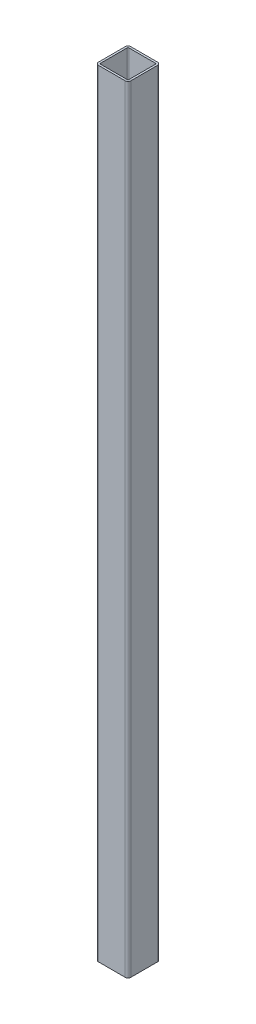
ISO-10303-21;
HEADER;
FILE_DESCRIPTION(('STEP AP214'),'2;1');
FILE_NAME('part.step','',(''),(''),'','','');
FILE_SCHEMA(('AUTOMOTIVE_DESIGN { 1 0 10303 214 1 1 1 1 }'));
ENDSEC;
DATA;
#1=APPLICATION_CONTEXT('core data for automotive mechanical design processes');
#2=APPLICATION_PROTOCOL_DEFINITION('international standard','automotive_design',2000,#1);
#3=PRODUCT_CONTEXT('',#1,'mechanical');
#4=PRODUCT('Part','Part','',(#3));
#5=PRODUCT_RELATED_PRODUCT_CATEGORY('part','',(#4));
#6=PRODUCT_DEFINITION_FORMATION('','',#4);
#7=PRODUCT_DEFINITION_CONTEXT('part definition',#1,'design');
#8=PRODUCT_DEFINITION('design','',#6,#7);
#9=PRODUCT_DEFINITION_SHAPE('','',#8);
#10=(LENGTH_UNIT() NAMED_UNIT(*) SI_UNIT(.MILLI.,.METRE.));
#11=(NAMED_UNIT(*) PLANE_ANGLE_UNIT() SI_UNIT($,.RADIAN.));
#12=(NAMED_UNIT(*) SI_UNIT($,.STERADIAN.) SOLID_ANGLE_UNIT());
#13=UNCERTAINTY_MEASURE_WITH_UNIT(LENGTH_MEASURE(1.E-05),#10,'distance_accuracy_value','');
#14=(GEOMETRIC_REPRESENTATION_CONTEXT(3) GLOBAL_UNCERTAINTY_ASSIGNED_CONTEXT((#13)) GLOBAL_UNIT_ASSIGNED_CONTEXT((#10,
#11,#12)) REPRESENTATION_CONTEXT('',''));
#15=CARTESIAN_POINT('',(0.,0.,0.));
#16=DIRECTION('',(0.,0.,1.));
#17=DIRECTION('',(1.,0.,0.));
#18=AXIS2_PLACEMENT_3D('',#15,#16,#17);
#19=CARTESIAN_POINT('',(20.955,1219.2,-20.955));
#20=DIRECTION('',(0.,-1.,0.));
#21=DIRECTION('',(0.,0.,-1.));
#22=AXIS2_PLACEMENT_3D('',#19,#20,#21);
#23=PLANE('',#22);
#24=CARTESIAN_POINT('',(20.955,1219.2,-20.955));
#25=DIRECTION('',(0.,1.,0.));
#26=DIRECTION('',(0.,0.,-1.));
#27=AXIS2_PLACEMENT_3D('',#24,#25,#26);
#28=CIRCLE('',#27,4.445);
#29=CARTESIAN_POINT('',(25.4,1219.2,-20.955));
#30=VERTEX_POINT('',#29);
#31=CARTESIAN_POINT('',(20.955,1219.2,-25.4));
#32=VERTEX_POINT('',#31);
#33=EDGE_CURVE('E211',#30,#32,#28,.T.);
#34=ORIENTED_EDGE('',*,*,#33,.T.);
#35=DIRECTION('',(-1.,0.,0.));
#36=VECTOR('',#35,1.);
#37=CARTESIAN_POINT('',(-20.955,1219.2,-25.4));
#38=LINE('',#37,#36);
#39=CARTESIAN_POINT('',(-20.955,1219.2,-25.4));
#40=VERTEX_POINT('',#39);
#41=EDGE_CURVE('E214',#32,#40,#38,.T.);
#42=ORIENTED_EDGE('',*,*,#41,.T.);
#43=CARTESIAN_POINT('',(-20.955,1219.2,-20.955));
#44=DIRECTION('',(0.,1.,0.));
#45=DIRECTION('',(0.,0.,-1.));
#46=AXIS2_PLACEMENT_3D('',#43,#44,#45);
#47=CIRCLE('',#46,4.445);
#48=CARTESIAN_POINT('',(-25.4,1219.2,-20.955));
#49=VERTEX_POINT('',#48);
#50=EDGE_CURVE('E217',#40,#49,#47,.T.);
#51=ORIENTED_EDGE('',*,*,#50,.T.);
#52=DIRECTION('',(0.,0.,1.));
#53=VECTOR('',#52,1.);
#54=CARTESIAN_POINT('',(-25.4,1219.2,20.955));
#55=LINE('',#54,#53);
#56=CARTESIAN_POINT('',(-25.4,1219.2,20.955));
#57=VERTEX_POINT('',#56);
#58=EDGE_CURVE('E219',#49,#57,#55,.T.);
#59=ORIENTED_EDGE('',*,*,#58,.T.);
#60=CARTESIAN_POINT('',(-20.955,1219.2,20.955));
#61=DIRECTION('',(0.,1.,0.));
#62=DIRECTION('',(0.,0.,-1.));
#63=AXIS2_PLACEMENT_3D('',#60,#61,#62);
#64=CIRCLE('',#63,4.445);
#65=CARTESIAN_POINT('',(-20.955,1219.2,25.4));
#66=VERTEX_POINT('',#65);
#67=EDGE_CURVE('E221',#57,#66,#64,.T.);
#68=ORIENTED_EDGE('',*,*,#67,.T.);
#69=DIRECTION('',(1.,0.,0.));
#70=VECTOR('',#69,1.);
#71=CARTESIAN_POINT('',(-20.955,1219.2,25.4));
#72=LINE('',#71,#70);
#73=CARTESIAN_POINT('',(20.955,1219.2,25.4));
#74=VERTEX_POINT('',#73);
#75=EDGE_CURVE('E223',#66,#74,#72,.T.);
#76=ORIENTED_EDGE('',*,*,#75,.T.);
#77=CARTESIAN_POINT('',(20.955,1219.2,20.955));
#78=DIRECTION('',(0.,1.,0.));
#79=DIRECTION('',(0.,0.,1.));
#80=AXIS2_PLACEMENT_3D('',#77,#78,#79);
#81=CIRCLE('',#80,4.445);
#82=CARTESIAN_POINT('',(25.4,1219.2,20.955));
#83=VERTEX_POINT('',#82);
#84=EDGE_CURVE('E225',#74,#83,#81,.T.);
#85=ORIENTED_EDGE('',*,*,#84,.T.);
#86=DIRECTION('',(0.,0.,-1.));
#87=VECTOR('',#86,1.);
#88=CARTESIAN_POINT('',(25.4,1219.2,20.955));
#89=LINE('',#88,#87);
#90=EDGE_CURVE('E227',#83,#30,#89,.T.);
#91=ORIENTED_EDGE('',*,*,#90,.T.);
#92=EDGE_LOOP('',(#34,#42,#51,#59,#68,#76,#85,#91));
#93=FACE_BOUND('',#92,.T.);
#94=CARTESIAN_POINT('',(-20.955,1219.2,20.955));
#95=DIRECTION('',(0.,1.,0.));
#96=DIRECTION('',(0.,0.,-1.));
#97=AXIS2_PLACEMENT_3D('',#94,#95,#96);
#98=CIRCLE('',#97,1.27);
#99=CARTESIAN_POINT('',(-22.225,1219.2,20.955));
#100=VERTEX_POINT('',#99);
#101=CARTESIAN_POINT('',(-20.955,1219.2,22.225));
#102=VERTEX_POINT('',#101);
#103=EDGE_CURVE('E146',#100,#102,#98,.T.);
#104=ORIENTED_EDGE('',*,*,#103,.F.);
#105=DIRECTION('',(0.,0.,1.));
#106=VECTOR('',#105,1.);
#107=CARTESIAN_POINT('',(-22.225,1219.2,20.955));
#108=LINE('',#107,#106);
#109=CARTESIAN_POINT('',(-22.225,1219.2,-20.955));
#110=VERTEX_POINT('',#109);
#111=EDGE_CURVE('E179',#110,#100,#108,.T.);
#112=ORIENTED_EDGE('',*,*,#111,.F.);
#113=CARTESIAN_POINT('',(-20.955,1219.2,-20.955));
#114=DIRECTION('',(0.,1.,0.));
#115=DIRECTION('',(0.,0.,-1.));
#116=AXIS2_PLACEMENT_3D('',#113,#114,#115);
#117=CIRCLE('',#116,1.27);
#118=CARTESIAN_POINT('',(-20.955,1219.2,-22.225));
#119=VERTEX_POINT('',#118);
#120=EDGE_CURVE('E177',#119,#110,#117,.T.);
#121=ORIENTED_EDGE('',*,*,#120,.F.);
#122=DIRECTION('',(-1.,0.,0.));
#123=VECTOR('',#122,1.);
#124=CARTESIAN_POINT('',(-20.955,1219.2,-22.225));
#125=LINE('',#124,#123);
#126=CARTESIAN_POINT('',(20.955,1219.2,-22.225));
#127=VERTEX_POINT('',#126);
#128=EDGE_CURVE('E175',#127,#119,#125,.T.);
#129=ORIENTED_EDGE('',*,*,#128,.F.);
#130=CARTESIAN_POINT('',(20.955,1219.2,-20.955));
#131=DIRECTION('',(0.,1.,0.));
#132=DIRECTION('',(0.,0.,-1.));
#133=AXIS2_PLACEMENT_3D('',#130,#131,#132);
#134=CIRCLE('',#133,1.27);
#135=CARTESIAN_POINT('',(22.225,1219.2,-20.955));
#136=VERTEX_POINT('',#135);
#137=EDGE_CURVE('E173',#136,#127,#134,.T.);
#138=ORIENTED_EDGE('',*,*,#137,.F.);
#139=DIRECTION('',(0.,0.,-1.));
#140=VECTOR('',#139,1.);
#141=CARTESIAN_POINT('',(22.225,1219.2,20.955));
#142=LINE('',#141,#140);
#143=CARTESIAN_POINT('',(22.225,1219.2,20.955));
#144=VERTEX_POINT('',#143);
#145=EDGE_CURVE('E169',#144,#136,#142,.T.);
#146=ORIENTED_EDGE('',*,*,#145,.F.);
#147=CARTESIAN_POINT('',(20.955,1219.2,20.955));
#148=DIRECTION('',(0.,1.,0.));
#149=DIRECTION('',(0.,0.,1.));
#150=AXIS2_PLACEMENT_3D('',#147,#148,#149);
#151=CIRCLE('',#150,1.27);
#152=CARTESIAN_POINT('',(20.955,1219.2,22.225));
#153=VERTEX_POINT('',#152);
#154=EDGE_CURVE('E167',#153,#144,#151,.T.);
#155=ORIENTED_EDGE('',*,*,#154,.F.);
#156=DIRECTION('',(1.,0.,0.));
#157=VECTOR('',#156,1.);
#158=CARTESIAN_POINT('',(-20.955,1219.2,22.225));
#159=LINE('',#158,#157);
#160=EDGE_CURVE('E154',#102,#153,#159,.T.);
#161=ORIENTED_EDGE('',*,*,#160,.F.);
#162=EDGE_LOOP('',(#104,#112,#121,#129,#138,#146,#155,#161));
#163=FACE_BOUND('',#162,.T.);
#164=ADVANCED_FACE('F33',(#93,#163),#23,.F.);
#165=CARTESIAN_POINT('',(20.955,0.,-20.955));
#166=DIRECTION('',(0.,-1.,0.));
#167=DIRECTION('',(0.,0.,-1.));
#168=AXIS2_PLACEMENT_3D('',#165,#166,#167);
#169=PLANE('',#168);
#170=CARTESIAN_POINT('',(20.955,0.,-20.955));
#171=DIRECTION('',(0.,1.,0.));
#172=DIRECTION('',(0.,0.,-1.));
#173=AXIS2_PLACEMENT_3D('',#170,#171,#172);
#174=CIRCLE('',#173,4.445);
#175=CARTESIAN_POINT('',(25.4,0.,-20.955));
#176=VERTEX_POINT('',#175);
#177=CARTESIAN_POINT('',(20.955,0.,-25.4));
#178=VERTEX_POINT('',#177);
#179=EDGE_CURVE('E162',#176,#178,#174,.T.);
#180=ORIENTED_EDGE('',*,*,#179,.F.);
#181=DIRECTION('',(0.,0.,-1.));
#182=VECTOR('',#181,1.);
#183=CARTESIAN_POINT('',(25.4,0.,20.955));
#184=LINE('',#183,#182);
#185=CARTESIAN_POINT('',(25.4,0.,20.955));
#186=VERTEX_POINT('',#185);
#187=EDGE_CURVE('E215',#186,#176,#184,.T.);
#188=ORIENTED_EDGE('',*,*,#187,.F.);
#189=CARTESIAN_POINT('',(20.955,0.,20.955));
#190=DIRECTION('',(0.,1.,0.));
#191=DIRECTION('',(0.,0.,1.));
#192=AXIS2_PLACEMENT_3D('',#189,#190,#191);
#193=CIRCLE('',#192,4.445);
#194=CARTESIAN_POINT('',(20.955,0.,25.4));
#195=VERTEX_POINT('',#194);
#196=EDGE_CURVE('E242',#195,#186,#193,.T.);
#197=ORIENTED_EDGE('',*,*,#196,.F.);
#198=DIRECTION('',(1.,0.,0.));
#199=VECTOR('',#198,1.);
#200=CARTESIAN_POINT('',(-20.955,0.,25.4));
#201=LINE('',#200,#199);
#202=CARTESIAN_POINT('',(-20.955,0.,25.4));
#203=VERTEX_POINT('',#202);
#204=EDGE_CURVE('E240',#203,#195,#201,.T.);
#205=ORIENTED_EDGE('',*,*,#204,.F.);
#206=CARTESIAN_POINT('',(-20.955,0.,20.955));
#207=DIRECTION('',(0.,1.,0.));
#208=DIRECTION('',(0.,0.,-1.));
#209=AXIS2_PLACEMENT_3D('',#206,#207,#208);
#210=CIRCLE('',#209,4.445);
#211=CARTESIAN_POINT('',(-25.4,0.,20.955));
#212=VERTEX_POINT('',#211);
#213=EDGE_CURVE('E238',#212,#203,#210,.T.);
#214=ORIENTED_EDGE('',*,*,#213,.F.);
#215=DIRECTION('',(0.,0.,1.));
#216=VECTOR('',#215,1.);
#217=CARTESIAN_POINT('',(-25.4,0.,20.955));
#218=LINE('',#217,#216);
#219=CARTESIAN_POINT('',(-25.4,0.,-20.955));
#220=VERTEX_POINT('',#219);
#221=EDGE_CURVE('E236',#220,#212,#218,.T.);
#222=ORIENTED_EDGE('',*,*,#221,.F.);
#223=CARTESIAN_POINT('',(-20.955,0.,-20.955));
#224=DIRECTION('',(0.,1.,0.));
#225=DIRECTION('',(0.,0.,-1.));
#226=AXIS2_PLACEMENT_3D('',#223,#224,#225);
#227=CIRCLE('',#226,4.445);
#228=CARTESIAN_POINT('',(-20.955,0.,-25.4));
#229=VERTEX_POINT('',#228);
#230=EDGE_CURVE('E234',#229,#220,#227,.T.);
#231=ORIENTED_EDGE('',*,*,#230,.F.);
#232=DIRECTION('',(-1.,0.,0.));
#233=VECTOR('',#232,1.);
#234=CARTESIAN_POINT('',(-20.955,0.,-25.4));
#235=LINE('',#234,#233);
#236=EDGE_CURVE('E232',#178,#229,#235,.T.);
#237=ORIENTED_EDGE('',*,*,#236,.F.);
#238=EDGE_LOOP('',(#180,#188,#197,#205,#214,#222,#231,#237));
#239=FACE_BOUND('',#238,.T.);
#240=DIRECTION('',(0.,0.,1.));
#241=VECTOR('',#240,1.);
#242=CARTESIAN_POINT('',(-22.225,0.,20.955));
#243=LINE('',#242,#241);
#244=CARTESIAN_POINT('',(-22.225,0.,-20.955));
#245=VERTEX_POINT('',#244);
#246=CARTESIAN_POINT('',(-22.225,0.,20.955));
#247=VERTEX_POINT('',#246);
#248=EDGE_CURVE('E155',#245,#247,#243,.T.);
#249=ORIENTED_EDGE('',*,*,#248,.T.);
#250=CARTESIAN_POINT('',(-20.955,0.,20.955));
#251=DIRECTION('',(0.,1.,0.));
#252=DIRECTION('',(0.,0.,-1.));
#253=AXIS2_PLACEMENT_3D('',#250,#251,#252);
#254=CIRCLE('',#253,1.27);
#255=CARTESIAN_POINT('',(-20.955,0.,22.225));
#256=VERTEX_POINT('',#255);
#257=EDGE_CURVE('E56',#247,#256,#254,.T.);
#258=ORIENTED_EDGE('',*,*,#257,.T.);
#259=DIRECTION('',(1.,0.,0.));
#260=VECTOR('',#259,1.);
#261=CARTESIAN_POINT('',(-20.955,0.,22.225));
#262=LINE('',#261,#260);
#263=CARTESIAN_POINT('',(20.955,0.,22.225));
#264=VERTEX_POINT('',#263);
#265=EDGE_CURVE('E161',#256,#264,#262,.T.);
#266=ORIENTED_EDGE('',*,*,#265,.T.);
#267=CARTESIAN_POINT('',(20.955,0.,20.955));
#268=DIRECTION('',(0.,1.,0.));
#269=DIRECTION('',(0.,0.,1.));
#270=AXIS2_PLACEMENT_3D('',#267,#268,#269);
#271=CIRCLE('',#270,1.27);
#272=CARTESIAN_POINT('',(22.225,0.,20.955));
#273=VERTEX_POINT('',#272);
#274=EDGE_CURVE('E183',#264,#273,#271,.T.);
#275=ORIENTED_EDGE('',*,*,#274,.T.);
#276=DIRECTION('',(0.,0.,-1.));
#277=VECTOR('',#276,1.);
#278=CARTESIAN_POINT('',(22.225,0.,20.955));
#279=LINE('',#278,#277);
#280=CARTESIAN_POINT('',(22.225,0.,-20.955));
#281=VERTEX_POINT('',#280);
#282=EDGE_CURVE('E186',#273,#281,#279,.T.);
#283=ORIENTED_EDGE('',*,*,#282,.T.);
#284=CARTESIAN_POINT('',(20.955,0.,-20.955));
#285=DIRECTION('',(0.,1.,0.));
#286=DIRECTION('',(0.,0.,-1.));
#287=AXIS2_PLACEMENT_3D('',#284,#285,#286);
#288=CIRCLE('',#287,1.27);
#289=CARTESIAN_POINT('',(20.955,0.,-22.225));
#290=VERTEX_POINT('',#289);
#291=EDGE_CURVE('E189',#281,#290,#288,.T.);
#292=ORIENTED_EDGE('',*,*,#291,.T.);
#293=DIRECTION('',(-1.,0.,0.));
#294=VECTOR('',#293,1.);
#295=CARTESIAN_POINT('',(-20.955,0.,-22.225));
#296=LINE('',#295,#294);
#297=CARTESIAN_POINT('',(-20.955,0.,-22.225));
#298=VERTEX_POINT('',#297);
#299=EDGE_CURVE('E192',#290,#298,#296,.T.);
#300=ORIENTED_EDGE('',*,*,#299,.T.);
#301=CARTESIAN_POINT('',(-20.955,0.,-20.955));
#302=DIRECTION('',(0.,1.,0.));
#303=DIRECTION('',(0.,0.,-1.));
#304=AXIS2_PLACEMENT_3D('',#301,#302,#303);
#305=CIRCLE('',#304,1.27);
#306=EDGE_CURVE('E195',#298,#245,#305,.T.);
#307=ORIENTED_EDGE('',*,*,#306,.T.);
#308=EDGE_LOOP('',(#249,#258,#266,#275,#283,#292,#300,#307));
#309=FACE_BOUND('',#308,.T.);
#310=ADVANCED_FACE('F272',(#239,#309),#169,.T.);
#311=CARTESIAN_POINT('',(20.955,1219.2,-20.955));
#312=DIRECTION('',(0.,-1.,0.));
#313=DIRECTION('',(0.,0.,-1.));
#314=AXIS2_PLACEMENT_3D('',#311,#312,#313);
#315=CYLINDRICAL_SURFACE('',#314,4.445);
#316=ORIENTED_EDGE('',*,*,#179,.T.);
#317=DIRECTION('',(0.,-1.,0.));
#318=VECTOR('',#317,1.);
#319=CARTESIAN_POINT('',(20.955,1219.2,-25.4));
#320=LINE('',#319,#318);
#321=EDGE_CURVE('E11',#32,#178,#320,.T.);
#322=ORIENTED_EDGE('',*,*,#321,.F.);
#323=ORIENTED_EDGE('',*,*,#33,.F.);
#324=DIRECTION('',(0.,-1.,0.));
#325=VECTOR('',#324,1.);
#326=CARTESIAN_POINT('',(25.4,1219.2,-20.955));
#327=LINE('',#326,#325);
#328=EDGE_CURVE('E229',#30,#176,#327,.T.);
#329=ORIENTED_EDGE('',*,*,#328,.T.);
#330=EDGE_LOOP('',(#316,#322,#323,#329));
#331=FACE_BOUND('',#330,.T.);
#332=ADVANCED_FACE('F35',(#331),#315,.T.);
#333=CARTESIAN_POINT('',(-20.955,1219.2,-25.4));
#334=DIRECTION('',(0.,0.,1.));
#335=DIRECTION('',(1.,0.,0.));
#336=AXIS2_PLACEMENT_3D('',#333,#334,#335);
#337=PLANE('',#336);
#338=ORIENTED_EDGE('',*,*,#236,.T.);
#339=DIRECTION('',(0.,-1.,0.));
#340=VECTOR('',#339,1.);
#341=CARTESIAN_POINT('',(-20.955,1219.2,-25.4));
#342=LINE('',#341,#340);
#343=EDGE_CURVE('E41',#40,#229,#342,.T.);
#344=ORIENTED_EDGE('',*,*,#343,.F.);
#345=ORIENTED_EDGE('',*,*,#41,.F.);
#346=ORIENTED_EDGE('',*,*,#321,.T.);
#347=EDGE_LOOP('',(#338,#344,#345,#346));
#348=FACE_BOUND('',#347,.T.);
#349=ADVANCED_FACE('F289',(#348),#337,.F.);
#350=CARTESIAN_POINT('',(-20.955,1219.2,-20.955));
#351=DIRECTION('',(0.,-1.,0.));
#352=DIRECTION('',(0.,0.,-1.));
#353=AXIS2_PLACEMENT_3D('',#350,#351,#352);
#354=CYLINDRICAL_SURFACE('',#353,4.445);
#355=ORIENTED_EDGE('',*,*,#230,.T.);
#356=DIRECTION('',(0.,-1.,0.));
#357=VECTOR('',#356,1.);
#358=CARTESIAN_POINT('',(-25.4,1219.2,-20.955));
#359=LINE('',#358,#357);
#360=EDGE_CURVE('E259',#49,#220,#359,.T.);
#361=ORIENTED_EDGE('',*,*,#360,.F.);
#362=ORIENTED_EDGE('',*,*,#50,.F.);
#363=ORIENTED_EDGE('',*,*,#343,.T.);
#364=EDGE_LOOP('',(#355,#361,#362,#363));
#365=FACE_BOUND('',#364,.T.);
#366=ADVANCED_FACE('F266',(#365),#354,.T.);
#367=CARTESIAN_POINT('',(-25.4,1219.2,20.955));
#368=DIRECTION('',(1.,0.,0.));
#369=DIRECTION('',(0.,0.,-1.));
#370=AXIS2_PLACEMENT_3D('',#367,#368,#369);
#371=PLANE('',#370);
#372=ORIENTED_EDGE('',*,*,#221,.T.);
#373=DIRECTION('',(0.,-1.,0.));
#374=VECTOR('',#373,1.);
#375=CARTESIAN_POINT('',(-25.4,1219.2,20.955));
#376=LINE('',#375,#374);
#377=EDGE_CURVE('E256',#57,#212,#376,.T.);
#378=ORIENTED_EDGE('',*,*,#377,.F.);
#379=ORIENTED_EDGE('',*,*,#58,.F.);
#380=ORIENTED_EDGE('',*,*,#360,.T.);
#381=EDGE_LOOP('',(#372,#378,#379,#380));
#382=FACE_BOUND('',#381,.T.);
#383=ADVANCED_FACE('F278',(#382),#371,.F.);
#384=CARTESIAN_POINT('',(-20.955,1219.2,20.955));
#385=DIRECTION('',(0.,-1.,0.));
#386=DIRECTION('',(0.,0.,-1.));
#387=AXIS2_PLACEMENT_3D('',#384,#385,#386);
#388=CYLINDRICAL_SURFACE('',#387,4.445);
#389=ORIENTED_EDGE('',*,*,#213,.T.);
#390=DIRECTION('',(0.,-1.,0.));
#391=VECTOR('',#390,1.);
#392=CARTESIAN_POINT('',(-20.955,1219.2,25.4));
#393=LINE('',#392,#391);
#394=EDGE_CURVE('E253',#66,#203,#393,.T.);
#395=ORIENTED_EDGE('',*,*,#394,.F.);
#396=ORIENTED_EDGE('',*,*,#67,.F.);
#397=ORIENTED_EDGE('',*,*,#377,.T.);
#398=EDGE_LOOP('',(#389,#395,#396,#397));
#399=FACE_BOUND('',#398,.T.);
#400=ADVANCED_FACE('F282',(#399),#388,.T.);
#401=CARTESIAN_POINT('',(-20.955,1219.2,25.4));
#402=DIRECTION('',(0.,0.,-1.));
#403=DIRECTION('',(-1.,0.,0.));
#404=AXIS2_PLACEMENT_3D('',#401,#402,#403);
#405=PLANE('',#404);
#406=ORIENTED_EDGE('',*,*,#204,.T.);
#407=DIRECTION('',(0.,-1.,0.));
#408=VECTOR('',#407,1.);
#409=CARTESIAN_POINT('',(20.955,1219.2,25.4));
#410=LINE('',#409,#408);
#411=EDGE_CURVE('E250',#74,#195,#410,.T.);
#412=ORIENTED_EDGE('',*,*,#411,.F.);
#413=ORIENTED_EDGE('',*,*,#75,.F.);
#414=ORIENTED_EDGE('',*,*,#394,.T.);
#415=EDGE_LOOP('',(#406,#412,#413,#414));
#416=FACE_BOUND('',#415,.T.);
#417=ADVANCED_FACE('F302',(#416),#405,.F.);
#418=CARTESIAN_POINT('',(20.955,1219.2,20.955));
#419=DIRECTION('',(0.,-1.,0.));
#420=DIRECTION('',(0.,0.,-1.));
#421=AXIS2_PLACEMENT_3D('',#418,#419,#420);
#422=CYLINDRICAL_SURFACE('',#421,4.445);
#423=ORIENTED_EDGE('',*,*,#196,.T.);
#424=DIRECTION('',(0.,-1.,0.));
#425=VECTOR('',#424,1.);
#426=CARTESIAN_POINT('',(25.4,1219.2,20.955));
#427=LINE('',#426,#425);
#428=EDGE_CURVE('E247',#83,#186,#427,.T.);
#429=ORIENTED_EDGE('',*,*,#428,.F.);
#430=ORIENTED_EDGE('',*,*,#84,.F.);
#431=ORIENTED_EDGE('',*,*,#411,.T.);
#432=EDGE_LOOP('',(#423,#429,#430,#431));
#433=FACE_BOUND('',#432,.T.);
#434=ADVANCED_FACE('F300',(#433),#422,.T.);
#435=CARTESIAN_POINT('',(25.4,1219.2,20.955));
#436=DIRECTION('',(-1.,0.,0.));
#437=DIRECTION('',(0.,0.,1.));
#438=AXIS2_PLACEMENT_3D('',#435,#436,#437);
#439=PLANE('',#438);
#440=ORIENTED_EDGE('',*,*,#187,.T.);
#441=ORIENTED_EDGE('',*,*,#328,.F.);
#442=ORIENTED_EDGE('',*,*,#90,.F.);
#443=ORIENTED_EDGE('',*,*,#428,.T.);
#444=EDGE_LOOP('',(#440,#441,#442,#443));
#445=FACE_BOUND('',#444,.T.);
#446=ADVANCED_FACE('F295',(#445),#439,.F.);
#447=CARTESIAN_POINT('',(-20.955,1219.2,20.955));
#448=DIRECTION('',(0.,-1.,0.));
#449=DIRECTION('',(0.,0.,-1.));
#450=AXIS2_PLACEMENT_3D('',#447,#448,#449);
#451=CYLINDRICAL_SURFACE('',#450,1.27);
#452=ORIENTED_EDGE('',*,*,#257,.F.);
#453=DIRECTION('',(0.,-1.,0.));
#454=VECTOR('',#453,1.);
#455=CARTESIAN_POINT('',(-22.225,1219.2,20.955));
#456=LINE('',#455,#454);
#457=EDGE_CURVE('E150',#100,#247,#456,.T.);
#458=ORIENTED_EDGE('',*,*,#457,.F.);
#459=ORIENTED_EDGE('',*,*,#103,.T.);
#460=DIRECTION('',(0.,-1.,0.));
#461=VECTOR('',#460,1.);
#462=CARTESIAN_POINT('',(-20.955,1219.2,22.225));
#463=LINE('',#462,#461);
#464=EDGE_CURVE('E149',#102,#256,#463,.T.);
#465=ORIENTED_EDGE('',*,*,#464,.T.);
#466=EDGE_LOOP('',(#452,#458,#459,#465));
#467=FACE_BOUND('',#466,.T.);
#468=ADVANCED_FACE('F148',(#467),#451,.F.);
#469=CARTESIAN_POINT('',(-20.955,1219.2,22.225));
#470=DIRECTION('',(0.,0.,-1.));
#471=DIRECTION('',(-1.,0.,0.));
#472=AXIS2_PLACEMENT_3D('',#469,#470,#471);
#473=PLANE('',#472);
#474=ORIENTED_EDGE('',*,*,#265,.F.);
#475=ORIENTED_EDGE('',*,*,#464,.F.);
#476=ORIENTED_EDGE('',*,*,#160,.T.);
#477=DIRECTION('',(0.,-1.,0.));
#478=VECTOR('',#477,1.);
#479=CARTESIAN_POINT('',(20.955,1219.2,22.225));
#480=LINE('',#479,#478);
#481=EDGE_CURVE('E163',#153,#264,#480,.T.);
#482=ORIENTED_EDGE('',*,*,#481,.T.);
#483=EDGE_LOOP('',(#474,#475,#476,#482));
#484=FACE_BOUND('',#483,.T.);
#485=ADVANCED_FACE('F158',(#484),#473,.T.);
#486=CARTESIAN_POINT('',(20.955,1219.2,20.955));
#487=DIRECTION('',(0.,-1.,0.));
#488=DIRECTION('',(0.,0.,-1.));
#489=AXIS2_PLACEMENT_3D('',#486,#487,#488);
#490=CYLINDRICAL_SURFACE('',#489,1.27);
#491=ORIENTED_EDGE('',*,*,#274,.F.);
#492=ORIENTED_EDGE('',*,*,#481,.F.);
#493=ORIENTED_EDGE('',*,*,#154,.T.);
#494=DIRECTION('',(0.,-1.,0.));
#495=VECTOR('',#494,1.);
#496=CARTESIAN_POINT('',(22.225,1219.2,20.955));
#497=LINE('',#496,#495);
#498=EDGE_CURVE('E208',#144,#273,#497,.T.);
#499=ORIENTED_EDGE('',*,*,#498,.T.);
#500=EDGE_LOOP('',(#491,#492,#493,#499));
#501=FACE_BOUND('',#500,.T.);
#502=ADVANCED_FACE('F327',(#501),#490,.F.);
#503=CARTESIAN_POINT('',(22.225,1219.2,20.955));
#504=DIRECTION('',(-1.,0.,0.));
#505=DIRECTION('',(0.,0.,1.));
#506=AXIS2_PLACEMENT_3D('',#503,#504,#505);
#507=PLANE('',#506);
#508=ORIENTED_EDGE('',*,*,#282,.F.);
#509=ORIENTED_EDGE('',*,*,#498,.F.);
#510=ORIENTED_EDGE('',*,*,#145,.T.);
#511=DIRECTION('',(0.,-1.,0.));
#512=VECTOR('',#511,1.);
#513=CARTESIAN_POINT('',(22.225,1219.2,-20.955));
#514=LINE('',#513,#512);
#515=EDGE_CURVE('E206',#136,#281,#514,.T.);
#516=ORIENTED_EDGE('',*,*,#515,.T.);
#517=EDGE_LOOP('',(#508,#509,#510,#516));
#518=FACE_BOUND('',#517,.T.);
#519=ADVANCED_FACE('F331',(#518),#507,.T.);
#520=CARTESIAN_POINT('',(20.955,1219.2,-20.955));
#521=DIRECTION('',(0.,-1.,0.));
#522=DIRECTION('',(0.,0.,-1.));
#523=AXIS2_PLACEMENT_3D('',#520,#521,#522);
#524=CYLINDRICAL_SURFACE('',#523,1.27);
#525=ORIENTED_EDGE('',*,*,#291,.F.);
#526=ORIENTED_EDGE('',*,*,#515,.F.);
#527=ORIENTED_EDGE('',*,*,#137,.T.);
#528=DIRECTION('',(0.,-1.,0.));
#529=VECTOR('',#528,1.);
#530=CARTESIAN_POINT('',(20.955,1219.2,-22.225));
#531=LINE('',#530,#529);
#532=EDGE_CURVE('E204',#127,#290,#531,.T.);
#533=ORIENTED_EDGE('',*,*,#532,.T.);
#534=EDGE_LOOP('',(#525,#526,#527,#533));
#535=FACE_BOUND('',#534,.T.);
#536=ADVANCED_FACE('F337',(#535),#524,.F.);
#537=CARTESIAN_POINT('',(-20.955,1219.2,-22.225));
#538=DIRECTION('',(0.,0.,1.));
#539=DIRECTION('',(1.,0.,0.));
#540=AXIS2_PLACEMENT_3D('',#537,#538,#539);
#541=PLANE('',#540);
#542=ORIENTED_EDGE('',*,*,#299,.F.);
#543=ORIENTED_EDGE('',*,*,#532,.F.);
#544=ORIENTED_EDGE('',*,*,#128,.T.);
#545=DIRECTION('',(0.,-1.,0.));
#546=VECTOR('',#545,1.);
#547=CARTESIAN_POINT('',(-20.955,1219.2,-22.225));
#548=LINE('',#547,#546);
#549=EDGE_CURVE('E202',#119,#298,#548,.T.);
#550=ORIENTED_EDGE('',*,*,#549,.T.);
#551=EDGE_LOOP('',(#542,#543,#544,#550));
#552=FACE_BOUND('',#551,.T.);
#553=ADVANCED_FACE('F341',(#552),#541,.T.);
#554=CARTESIAN_POINT('',(-20.955,1219.2,-20.955));
#555=DIRECTION('',(0.,-1.,0.));
#556=DIRECTION('',(0.,0.,-1.));
#557=AXIS2_PLACEMENT_3D('',#554,#555,#556);
#558=CYLINDRICAL_SURFACE('',#557,1.27);
#559=ORIENTED_EDGE('',*,*,#306,.F.);
#560=ORIENTED_EDGE('',*,*,#549,.F.);
#561=ORIENTED_EDGE('',*,*,#120,.T.);
#562=DIRECTION('',(0.,-1.,0.));
#563=VECTOR('',#562,1.);
#564=CARTESIAN_POINT('',(-22.225,1219.2,-20.955));
#565=LINE('',#564,#563);
#566=EDGE_CURVE('E48',#110,#245,#565,.T.);
#567=ORIENTED_EDGE('',*,*,#566,.T.);
#568=EDGE_LOOP('',(#559,#560,#561,#567));
#569=FACE_BOUND('',#568,.T.);
#570=ADVANCED_FACE('F345',(#569),#558,.F.);
#571=CARTESIAN_POINT('',(-22.225,1219.2,20.955));
#572=DIRECTION('',(1.,0.,0.));
#573=DIRECTION('',(0.,0.,-1.));
#574=AXIS2_PLACEMENT_3D('',#571,#572,#573);
#575=PLANE('',#574);
#576=ORIENTED_EDGE('',*,*,#248,.F.);
#577=ORIENTED_EDGE('',*,*,#566,.F.);
#578=ORIENTED_EDGE('',*,*,#111,.T.);
#579=ORIENTED_EDGE('',*,*,#457,.T.);
#580=EDGE_LOOP('',(#576,#577,#578,#579));
#581=FACE_BOUND('',#580,.T.);
#582=ADVANCED_FACE('F349',(#581),#575,.T.);
#583=CLOSED_SHELL('',(#164,#310,#332,#349,#366,#383,#400,#417,#434,#446,#468,#485,#502,#519,
#536,#553,#570,#582));
#584=MANIFOLD_SOLID_BREP('B2',#583);
#585=ADVANCED_BREP_SHAPE_REPRESENTATION('',(#18,#584),#14);
#586=SHAPE_DEFINITION_REPRESENTATION(#9,#585);
ENDSEC;
END-ISO-10303-21;
